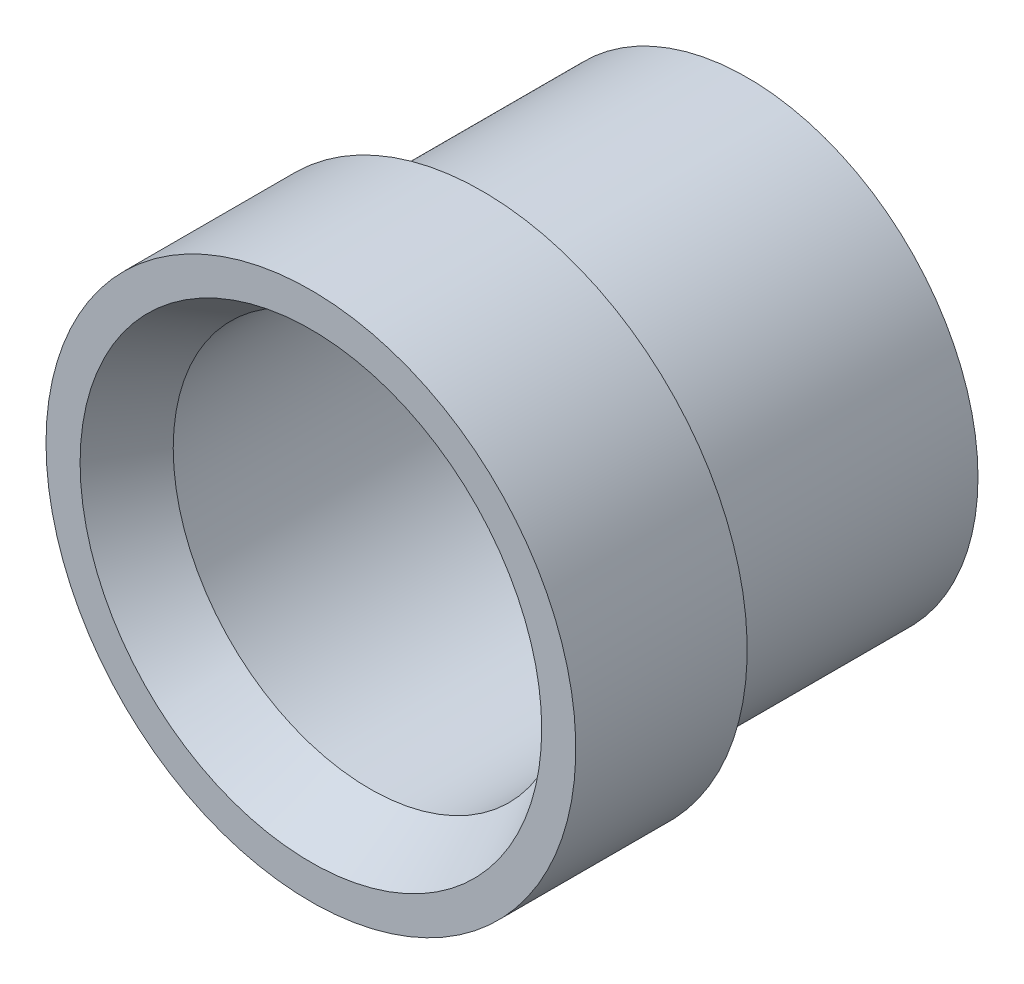
ISO-10303-21;
HEADER;
FILE_DESCRIPTION(('STEP AP214'),'2;1');
FILE_NAME('part.step','',(''),(''),'','','');
FILE_SCHEMA(('AUTOMOTIVE_DESIGN { 1 0 10303 214 1 1 1 1 }'));
ENDSEC;
DATA;
#1=APPLICATION_CONTEXT('core data for automotive mechanical design processes');
#2=APPLICATION_PROTOCOL_DEFINITION('international standard','automotive_design',2000,#1);
#3=PRODUCT_CONTEXT('',#1,'mechanical');
#4=PRODUCT('Part','Part','',(#3));
#5=PRODUCT_RELATED_PRODUCT_CATEGORY('part','',(#4));
#6=PRODUCT_DEFINITION_FORMATION('','',#4);
#7=PRODUCT_DEFINITION_CONTEXT('part definition',#1,'design');
#8=PRODUCT_DEFINITION('design','',#6,#7);
#9=PRODUCT_DEFINITION_SHAPE('','',#8);
#10=(LENGTH_UNIT() NAMED_UNIT(*) SI_UNIT(.MILLI.,.METRE.));
#11=(NAMED_UNIT(*) PLANE_ANGLE_UNIT() SI_UNIT($,.RADIAN.));
#12=(NAMED_UNIT(*) SI_UNIT($,.STERADIAN.) SOLID_ANGLE_UNIT());
#13=UNCERTAINTY_MEASURE_WITH_UNIT(LENGTH_MEASURE(1.E-05),#10,'distance_accuracy_value','');
#14=(GEOMETRIC_REPRESENTATION_CONTEXT(3) GLOBAL_UNCERTAINTY_ASSIGNED_CONTEXT((#13)) GLOBAL_UNIT_ASSIGNED_CONTEXT((#10,
#11,#12)) REPRESENTATION_CONTEXT('',''));
#15=CARTESIAN_POINT('',(0.,0.,0.));
#16=DIRECTION('',(0.,0.,1.));
#17=DIRECTION('',(1.,0.,0.));
#18=AXIS2_PLACEMENT_3D('',#15,#16,#17);
#19=CARTESIAN_POINT('',(0.,8.636,7.112));
#20=DIRECTION('',(0.,0.,1.));
#21=DIRECTION('',(1.,0.,0.));
#22=AXIS2_PLACEMENT_3D('',#19,#20,#21);
#23=PLANE('',#22);
#24=CARTESIAN_POINT('',(0.,0.,7.112));
#25=DIRECTION('',(0.,0.,-1.));
#26=DIRECTION('',(-1.,0.,0.));
#27=AXIS2_PLACEMENT_3D('',#24,#25,#26);
#28=CIRCLE('',#27,7.52475);
#29=CARTESIAN_POINT('',(-7.52475,0.,7.112));
#30=VERTEX_POINT('',#29);
#31=EDGE_CURVE('E10',#30,#30,#28,.T.);
#32=ORIENTED_EDGE('',*,*,#31,.T.);
#33=EDGE_LOOP('',(#32));
#34=FACE_BOUND('',#33,.T.);
#35=CARTESIAN_POINT('',(0.,0.,7.112));
#36=DIRECTION('',(0.,0.,-1.));
#37=DIRECTION('',(-1.,0.,0.));
#38=AXIS2_PLACEMENT_3D('',#35,#36,#37);
#39=CIRCLE('',#38,8.636);
#40=CARTESIAN_POINT('',(-8.636,0.,7.112));
#41=VERTEX_POINT('',#40);
#42=EDGE_CURVE('E55',#41,#41,#39,.T.);
#43=ORIENTED_EDGE('',*,*,#42,.F.);
#44=EDGE_LOOP('',(#43));
#45=FACE_BOUND('',#44,.T.);
#46=ADVANCED_FACE('F30',(#34,#45),#23,.T.);
#47=CARTESIAN_POINT('',(0.,0.,7.112));
#48=DIRECTION('',(0.,0.,1.));
#49=DIRECTION('',(1.,0.,0.));
#50=AXIS2_PLACEMENT_3D('',#47,#48,#49);
#51=CONICAL_SURFACE('',#50,7.52475,0.5235987755983);
#52=CARTESIAN_POINT('',(0.,0.,5.18725854008909));
#53=DIRECTION('',(0.,0.,-1.));
#54=DIRECTION('',(-1.,0.,0.));
#55=AXIS2_PLACEMENT_3D('',#52,#53,#54);
#56=CIRCLE('',#55,6.4135);
#57=CARTESIAN_POINT('',(-6.4135,0.,5.18725854008909));
#58=VERTEX_POINT('',#57);
#59=EDGE_CURVE('E36',#58,#58,#56,.T.);
#60=ORIENTED_EDGE('',*,*,#59,.T.);
#61=EDGE_LOOP('',(#60));
#62=FACE_BOUND('',#61,.T.);
#63=ORIENTED_EDGE('',*,*,#31,.F.);
#64=EDGE_LOOP('',(#63));
#65=FACE_BOUND('',#64,.T.);
#66=ADVANCED_FACE('F63',(#62,#65),#51,.F.);
#67=CARTESIAN_POINT('',(0.,0.,-7.112));
#68=DIRECTION('',(0.,0.,-1.));
#69=DIRECTION('',(-1.,0.,0.));
#70=AXIS2_PLACEMENT_3D('',#67,#68,#69);
#71=CYLINDRICAL_SURFACE('',#70,6.4135);
#72=CARTESIAN_POINT('',(0.,0.,-7.112));
#73=DIRECTION('',(0.,0.,-1.));
#74=DIRECTION('',(-1.,0.,0.));
#75=AXIS2_PLACEMENT_3D('',#72,#73,#74);
#76=CIRCLE('',#75,6.4135);
#77=CARTESIAN_POINT('',(-6.4135,0.,-7.112));
#78=VERTEX_POINT('',#77);
#79=EDGE_CURVE('E40',#78,#78,#76,.T.);
#80=ORIENTED_EDGE('',*,*,#79,.T.);
#81=EDGE_LOOP('',(#80));
#82=FACE_BOUND('',#81,.T.);
#83=ORIENTED_EDGE('',*,*,#59,.F.);
#84=EDGE_LOOP('',(#83));
#85=FACE_BOUND('',#84,.T.);
#86=ADVANCED_FACE('F67',(#82,#85),#71,.F.);
#87=CARTESIAN_POINT('',(0.,6.4135,-7.112));
#88=DIRECTION('',(0.,0.,-1.));
#89=DIRECTION('',(-1.,0.,0.));
#90=AXIS2_PLACEMENT_3D('',#87,#88,#89);
#91=PLANE('',#90);
#92=CARTESIAN_POINT('',(0.,0.,-7.112));
#93=DIRECTION('',(0.,0.,-1.));
#94=DIRECTION('',(-1.,0.,0.));
#95=AXIS2_PLACEMENT_3D('',#92,#93,#94);
#96=CIRCLE('',#95,7.52475);
#97=CARTESIAN_POINT('',(-7.52475,0.,-7.112));
#98=VERTEX_POINT('',#97);
#99=EDGE_CURVE('E44',#98,#98,#96,.T.);
#100=ORIENTED_EDGE('',*,*,#99,.T.);
#101=EDGE_LOOP('',(#100));
#102=FACE_BOUND('',#101,.T.);
#103=ORIENTED_EDGE('',*,*,#79,.F.);
#104=EDGE_LOOP('',(#103));
#105=FACE_BOUND('',#104,.T.);
#106=ADVANCED_FACE('F71',(#102,#105),#91,.T.);
#107=CARTESIAN_POINT('',(0.,0.,-7.112));
#108=DIRECTION('',(0.,0.,-1.));
#109=DIRECTION('',(-1.,0.,0.));
#110=AXIS2_PLACEMENT_3D('',#107,#108,#109);
#111=CYLINDRICAL_SURFACE('',#110,7.52475);
#112=CARTESIAN_POINT('',(0.,0.,1.524));
#113=DIRECTION('',(0.,0.,-1.));
#114=DIRECTION('',(-1.,0.,0.));
#115=AXIS2_PLACEMENT_3D('',#112,#113,#114);
#116=CIRCLE('',#115,7.52475);
#117=CARTESIAN_POINT('',(-7.52475,0.,1.524));
#118=VERTEX_POINT('',#117);
#119=EDGE_CURVE('E49',#118,#118,#116,.T.);
#120=ORIENTED_EDGE('',*,*,#119,.T.);
#121=EDGE_LOOP('',(#120));
#122=FACE_BOUND('',#121,.T.);
#123=ORIENTED_EDGE('',*,*,#99,.F.);
#124=EDGE_LOOP('',(#123));
#125=FACE_BOUND('',#124,.T.);
#126=ADVANCED_FACE('F78',(#122,#125),#111,.T.);
#127=CARTESIAN_POINT('',(0.,7.52475,1.524));
#128=DIRECTION('',(0.,0.,-1.));
#129=DIRECTION('',(-1.,0.,0.));
#130=AXIS2_PLACEMENT_3D('',#127,#128,#129);
#131=PLANE('',#130);
#132=CARTESIAN_POINT('',(0.,0.,1.524));
#133=DIRECTION('',(0.,0.,-1.));
#134=DIRECTION('',(-1.,0.,0.));
#135=AXIS2_PLACEMENT_3D('',#132,#133,#134);
#136=CIRCLE('',#135,8.636);
#137=CARTESIAN_POINT('',(-8.636,0.,1.524));
#138=VERTEX_POINT('',#137);
#139=EDGE_CURVE('E52',#138,#138,#136,.T.);
#140=ORIENTED_EDGE('',*,*,#139,.T.);
#141=EDGE_LOOP('',(#140));
#142=FACE_BOUND('',#141,.T.);
#143=ORIENTED_EDGE('',*,*,#119,.F.);
#144=EDGE_LOOP('',(#143));
#145=FACE_BOUND('',#144,.T.);
#146=ADVANCED_FACE('F82',(#142,#145),#131,.T.);
#147=CARTESIAN_POINT('',(0.,0.,-7.112));
#148=DIRECTION('',(0.,0.,-1.));
#149=DIRECTION('',(-1.,0.,0.));
#150=AXIS2_PLACEMENT_3D('',#147,#148,#149);
#151=CYLINDRICAL_SURFACE('',#150,8.636);
#152=ORIENTED_EDGE('',*,*,#42,.T.);
#153=EDGE_LOOP('',(#152));
#154=FACE_BOUND('',#153,.T.);
#155=ORIENTED_EDGE('',*,*,#139,.F.);
#156=EDGE_LOOP('',(#155));
#157=FACE_BOUND('',#156,.T.);
#158=ADVANCED_FACE('F59',(#154,#157),#151,.T.);
#159=CLOSED_SHELL('',(#46,#66,#86,#106,#126,#146,#158));
#160=MANIFOLD_SOLID_BREP('B2',#159);
#161=ADVANCED_BREP_SHAPE_REPRESENTATION('',(#18,#160),#14);
#162=SHAPE_DEFINITION_REPRESENTATION(#9,#161);
ENDSEC;
END-ISO-10303-21;
